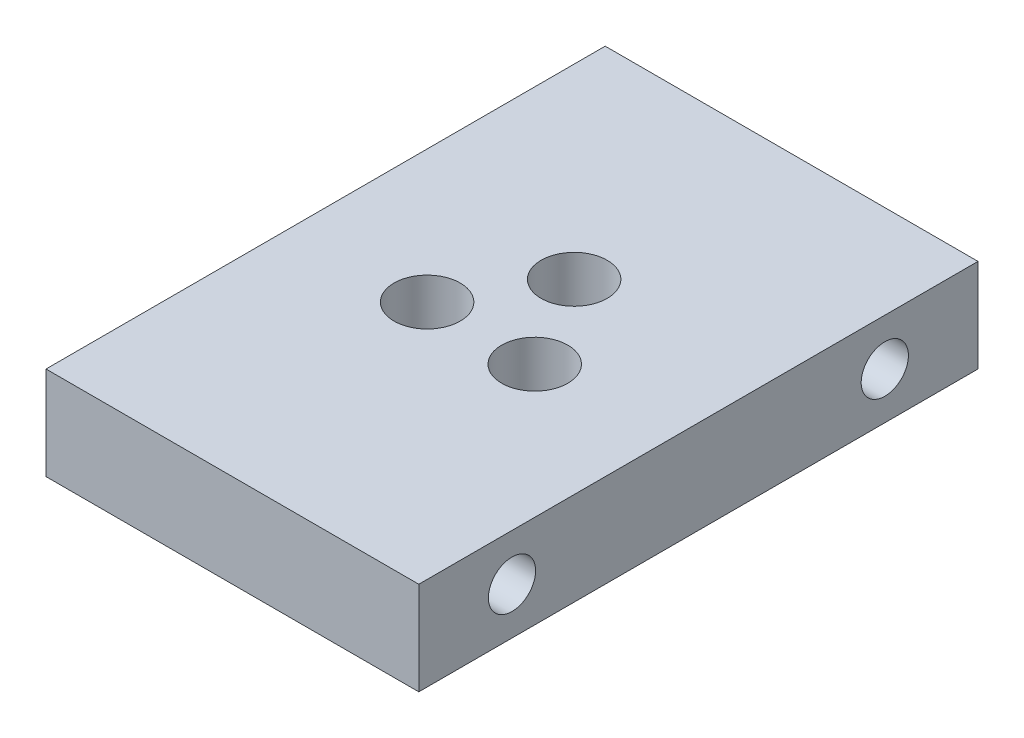
ISO-10303-21;
HEADER;
FILE_DESCRIPTION(('STEP AP214'),'2;1');
FILE_NAME('part.step','',(''),(''),'','','');
FILE_SCHEMA(('AUTOMOTIVE_DESIGN { 1 0 10303 214 1 1 1 1 }'));
ENDSEC;
DATA;
#1=APPLICATION_CONTEXT('core data for automotive mechanical design processes');
#2=APPLICATION_PROTOCOL_DEFINITION('international standard','automotive_design',2000,#1);
#3=PRODUCT_CONTEXT('',#1,'mechanical');
#4=PRODUCT('Part','Part','',(#3));
#5=PRODUCT_RELATED_PRODUCT_CATEGORY('part','',(#4));
#6=PRODUCT_DEFINITION_FORMATION('','',#4);
#7=PRODUCT_DEFINITION_CONTEXT('part definition',#1,'design');
#8=PRODUCT_DEFINITION('design','',#6,#7);
#9=PRODUCT_DEFINITION_SHAPE('','',#8);
#10=(LENGTH_UNIT() NAMED_UNIT(*) SI_UNIT(.MILLI.,.METRE.));
#11=(NAMED_UNIT(*) PLANE_ANGLE_UNIT() SI_UNIT($,.RADIAN.));
#12=(NAMED_UNIT(*) SI_UNIT($,.STERADIAN.) SOLID_ANGLE_UNIT());
#13=UNCERTAINTY_MEASURE_WITH_UNIT(LENGTH_MEASURE(1.E-05),#10,'distance_accuracy_value','');
#14=(GEOMETRIC_REPRESENTATION_CONTEXT(3) GLOBAL_UNCERTAINTY_ASSIGNED_CONTEXT((#13)) GLOBAL_UNIT_ASSIGNED_CONTEXT((#10,
#11,#12)) REPRESENTATION_CONTEXT('',''));
#15=CARTESIAN_POINT('',(0.,0.,0.));
#16=DIRECTION('',(0.,0.,1.));
#17=DIRECTION('',(1.,0.,0.));
#18=AXIS2_PLACEMENT_3D('',#15,#16,#17);
#19=CARTESIAN_POINT('',(19.05,9.525,-28.575));
#20=DIRECTION('',(-1.,0.,0.));
#21=DIRECTION('',(0.,0.,1.));
#22=AXIS2_PLACEMENT_3D('',#19,#20,#21);
#23=PLANE('',#22);
#24=CARTESIAN_POINT('',(19.05,4.7625,19.05));
#25=DIRECTION('',(1.,0.,0.));
#26=DIRECTION('',(0.,0.,-1.));
#27=AXIS2_PLACEMENT_3D('',#24,#25,#26);
#28=CIRCLE('',#27,2.413);
#29=CARTESIAN_POINT('',(19.05,4.7625,16.637));
#30=VERTEX_POINT('',#29);
#31=EDGE_CURVE('E140',#30,#30,#28,.T.);
#32=ORIENTED_EDGE('',*,*,#31,.F.);
#33=EDGE_LOOP('',(#32));
#34=FACE_BOUND('',#33,.T.);
#35=CARTESIAN_POINT('',(19.05,4.7625,-19.05));
#36=DIRECTION('',(1.,0.,0.));
#37=DIRECTION('',(0.,0.,-1.));
#38=AXIS2_PLACEMENT_3D('',#35,#36,#37);
#39=CIRCLE('',#38,2.413);
#40=CARTESIAN_POINT('',(19.05,4.7625,-21.463));
#41=VERTEX_POINT('',#40);
#42=EDGE_CURVE('E152',#41,#41,#39,.T.);
#43=ORIENTED_EDGE('',*,*,#42,.F.);
#44=EDGE_LOOP('',(#43));
#45=FACE_BOUND('',#44,.T.);
#46=DIRECTION('',(0.,0.,-1.));
#47=VECTOR('',#46,1.);
#48=CARTESIAN_POINT('',(19.05,0.,-28.575));
#49=LINE('',#48,#47);
#50=CARTESIAN_POINT('',(19.05,0.,28.575));
#51=VERTEX_POINT('',#50);
#52=CARTESIAN_POINT('',(19.05,0.,-28.575));
#53=VERTEX_POINT('',#52);
#54=EDGE_CURVE('E206',#51,#53,#49,.T.);
#55=ORIENTED_EDGE('',*,*,#54,.T.);
#56=DIRECTION('',(0.,-1.,0.));
#57=VECTOR('',#56,1.);
#58=CARTESIAN_POINT('',(19.05,9.525,-28.575));
#59=LINE('',#58,#57);
#60=CARTESIAN_POINT('',(19.05,9.525,-28.575));
#61=VERTEX_POINT('',#60);
#62=EDGE_CURVE('E11',#61,#53,#59,.T.);
#63=ORIENTED_EDGE('',*,*,#62,.F.);
#64=DIRECTION('',(0.,0.,-1.));
#65=VECTOR('',#64,1.);
#66=CARTESIAN_POINT('',(19.05,9.525,-28.575));
#67=LINE('',#66,#65);
#68=CARTESIAN_POINT('',(19.05,9.525,28.575));
#69=VERTEX_POINT('',#68);
#70=EDGE_CURVE('E207',#69,#61,#67,.T.);
#71=ORIENTED_EDGE('',*,*,#70,.F.);
#72=DIRECTION('',(0.,-1.,0.));
#73=VECTOR('',#72,1.);
#74=CARTESIAN_POINT('',(19.05,9.525,28.575));
#75=LINE('',#74,#73);
#76=EDGE_CURVE('E213',#69,#51,#75,.T.);
#77=ORIENTED_EDGE('',*,*,#76,.T.);
#78=EDGE_LOOP('',(#55,#63,#71,#77));
#79=FACE_BOUND('',#78,.T.);
#80=ADVANCED_FACE('F33',(#34,#45,#79),#23,.F.);
#81=CARTESIAN_POINT('',(-19.05,9.525,-28.575));
#82=DIRECTION('',(0.,0.,1.));
#83=DIRECTION('',(1.,0.,0.));
#84=AXIS2_PLACEMENT_3D('',#81,#82,#83);
#85=PLANE('',#84);
#86=DIRECTION('',(-1.,0.,0.));
#87=VECTOR('',#86,1.);
#88=CARTESIAN_POINT('',(-19.05,0.,-28.575));
#89=LINE('',#88,#87);
#90=CARTESIAN_POINT('',(-19.05,0.,-28.575));
#91=VERTEX_POINT('',#90);
#92=EDGE_CURVE('E216',#53,#91,#89,.T.);
#93=ORIENTED_EDGE('',*,*,#92,.T.);
#94=DIRECTION('',(0.,-1.,0.));
#95=VECTOR('',#94,1.);
#96=CARTESIAN_POINT('',(-19.05,9.525,-28.575));
#97=LINE('',#96,#95);
#98=CARTESIAN_POINT('',(-19.05,9.525,-28.575));
#99=VERTEX_POINT('',#98);
#100=EDGE_CURVE('E41',#99,#91,#97,.T.);
#101=ORIENTED_EDGE('',*,*,#100,.F.);
#102=DIRECTION('',(-1.,0.,0.));
#103=VECTOR('',#102,1.);
#104=CARTESIAN_POINT('',(-19.05,9.525,-28.575));
#105=LINE('',#104,#103);
#106=EDGE_CURVE('E80',#61,#99,#105,.T.);
#107=ORIENTED_EDGE('',*,*,#106,.F.);
#108=ORIENTED_EDGE('',*,*,#62,.T.);
#109=EDGE_LOOP('',(#93,#101,#107,#108));
#110=FACE_BOUND('',#109,.T.);
#111=ADVANCED_FACE('F240',(#110),#85,.F.);
#112=CARTESIAN_POINT('',(-19.05,9.525,-28.575));
#113=DIRECTION('',(1.,0.,0.));
#114=DIRECTION('',(0.,0.,-1.));
#115=AXIS2_PLACEMENT_3D('',#112,#113,#114);
#116=PLANE('',#115);
#117=CARTESIAN_POINT('',(-19.05,4.7625,-19.05));
#118=DIRECTION('',(-1.,0.,0.));
#119=DIRECTION('',(0.,0.,1.));
#120=AXIS2_PLACEMENT_3D('',#117,#118,#119);
#121=CIRCLE('',#120,2.413);
#122=CARTESIAN_POINT('',(-19.05,4.7625,-16.637));
#123=VERTEX_POINT('',#122);
#124=EDGE_CURVE('E488',#123,#123,#121,.T.);
#125=ORIENTED_EDGE('',*,*,#124,.F.);
#126=EDGE_LOOP('',(#125));
#127=FACE_BOUND('',#126,.T.);
#128=CARTESIAN_POINT('',(-19.05,4.7625,19.05));
#129=DIRECTION('',(-1.,0.,0.));
#130=DIRECTION('',(0.,0.,1.));
#131=AXIS2_PLACEMENT_3D('',#128,#129,#130);
#132=CIRCLE('',#131,2.413);
#133=CARTESIAN_POINT('',(-19.05,4.7625,21.463));
#134=VERTEX_POINT('',#133);
#135=EDGE_CURVE('E121',#134,#134,#132,.T.);
#136=ORIENTED_EDGE('',*,*,#135,.F.);
#137=EDGE_LOOP('',(#136));
#138=FACE_BOUND('',#137,.T.);
#139=DIRECTION('',(0.,0.,1.));
#140=VECTOR('',#139,1.);
#141=CARTESIAN_POINT('',(-19.05,0.,-28.575));
#142=LINE('',#141,#140);
#143=CARTESIAN_POINT('',(-19.05,0.,28.575));
#144=VERTEX_POINT('',#143);
#145=EDGE_CURVE('E67',#91,#144,#142,.T.);
#146=ORIENTED_EDGE('',*,*,#145,.T.);
#147=DIRECTION('',(0.,-1.,0.));
#148=VECTOR('',#147,1.);
#149=CARTESIAN_POINT('',(-19.05,9.525,28.575));
#150=LINE('',#149,#148);
#151=CARTESIAN_POINT('',(-19.05,9.525,28.575));
#152=VERTEX_POINT('',#151);
#153=EDGE_CURVE('E221',#152,#144,#150,.T.);
#154=ORIENTED_EDGE('',*,*,#153,.F.);
#155=DIRECTION('',(0.,0.,1.));
#156=VECTOR('',#155,1.);
#157=CARTESIAN_POINT('',(-19.05,9.525,-28.575));
#158=LINE('',#157,#156);
#159=EDGE_CURVE('E210',#99,#152,#158,.T.);
#160=ORIENTED_EDGE('',*,*,#159,.F.);
#161=ORIENTED_EDGE('',*,*,#100,.T.);
#162=EDGE_LOOP('',(#146,#154,#160,#161));
#163=FACE_BOUND('',#162,.T.);
#164=ADVANCED_FACE('F223',(#127,#138,#163),#116,.F.);
#165=CARTESIAN_POINT('',(-19.05,9.525,28.575));
#166=DIRECTION('',(0.,0.,-1.));
#167=DIRECTION('',(-1.,0.,0.));
#168=AXIS2_PLACEMENT_3D('',#165,#166,#167);
#169=PLANE('',#168);
#170=DIRECTION('',(1.,0.,0.));
#171=VECTOR('',#170,1.);
#172=CARTESIAN_POINT('',(-19.05,0.,28.575));
#173=LINE('',#172,#171);
#174=EDGE_CURVE('E73',#144,#51,#173,.T.);
#175=ORIENTED_EDGE('',*,*,#174,.T.);
#176=ORIENTED_EDGE('',*,*,#76,.F.);
#177=DIRECTION('',(1.,0.,0.));
#178=VECTOR('',#177,1.);
#179=CARTESIAN_POINT('',(-19.05,9.525,28.575));
#180=LINE('',#179,#178);
#181=EDGE_CURVE('E49',#152,#69,#180,.T.);
#182=ORIENTED_EDGE('',*,*,#181,.F.);
#183=ORIENTED_EDGE('',*,*,#153,.T.);
#184=EDGE_LOOP('',(#175,#176,#182,#183));
#185=FACE_BOUND('',#184,.T.);
#186=ADVANCED_FACE('F230',(#185),#169,.F.);
#187=CARTESIAN_POINT('',(0.,9.525,0.));
#188=DIRECTION('',(0.,1.,0.));
#189=DIRECTION('',(0.,0.,1.));
#190=AXIS2_PLACEMENT_3D('',#187,#188,#189);
#191=PLANE('',#190);
#192=CARTESIAN_POINT('',(0.,9.525,-6.35));
#193=DIRECTION('',(0.,-1.,0.));
#194=DIRECTION('',(0.,0.,-1.));
#195=AXIS2_PLACEMENT_3D('',#192,#193,#194);
#196=CIRCLE('',#195,3.3782);
#197=CARTESIAN_POINT('',(0.,9.525,-9.7282));
#198=VERTEX_POINT('',#197);
#199=EDGE_CURVE('E172',#198,#198,#196,.T.);
#200=ORIENTED_EDGE('',*,*,#199,.T.);
#201=EDGE_LOOP('',(#200));
#202=FACE_BOUND('',#201,.T.);
#203=CARTESIAN_POINT('',(-5.49926131403199,9.525,3.17499999999953));
#204=DIRECTION('',(0.,-1.,0.));
#205=DIRECTION('',(0.,0.,-1.));
#206=AXIS2_PLACEMENT_3D('',#203,#204,#205);
#207=CIRCLE('',#206,3.3782);
#208=CARTESIAN_POINT('',(-5.49926131403199,9.525,-0.203200000000466));
#209=VERTEX_POINT('',#208);
#210=EDGE_CURVE('E190',#209,#209,#207,.T.);
#211=ORIENTED_EDGE('',*,*,#210,.T.);
#212=EDGE_LOOP('',(#211));
#213=FACE_BOUND('',#212,.T.);
#214=CARTESIAN_POINT('',(5.49926131403038,9.525,3.17500000000047));
#215=DIRECTION('',(0.,-1.,0.));
#216=DIRECTION('',(0.,0.,-1.));
#217=AXIS2_PLACEMENT_3D('',#214,#215,#216);
#218=CIRCLE('',#217,3.3782);
#219=CARTESIAN_POINT('',(5.49926131403038,9.525,-0.203199999999531));
#220=VERTEX_POINT('',#219);
#221=EDGE_CURVE('E203',#220,#220,#218,.T.);
#222=ORIENTED_EDGE('',*,*,#221,.T.);
#223=EDGE_LOOP('',(#222));
#224=FACE_BOUND('',#223,.T.);
#225=ORIENTED_EDGE('',*,*,#70,.T.);
#226=ORIENTED_EDGE('',*,*,#106,.T.);
#227=ORIENTED_EDGE('',*,*,#159,.T.);
#228=ORIENTED_EDGE('',*,*,#181,.T.);
#229=EDGE_LOOP('',(#225,#226,#227,#228));
#230=FACE_BOUND('',#229,.T.);
#231=ADVANCED_FACE('F232',(#202,#213,#224,#230),#191,.T.);
#232=CARTESIAN_POINT('',(0.,0.,0.));
#233=DIRECTION('',(0.,1.,0.));
#234=DIRECTION('',(0.,0.,1.));
#235=AXIS2_PLACEMENT_3D('',#232,#233,#234);
#236=PLANE('',#235);
#237=CARTESIAN_POINT('',(5.49926131403038,0.,3.17500000000047));
#238=DIRECTION('',(0.,-1.,0.));
#239=DIRECTION('',(0.,0.,-1.));
#240=AXIS2_PLACEMENT_3D('',#237,#238,#239);
#241=CIRCLE('',#240,7.14374999999999);
#242=CARTESIAN_POINT('',(6.69848704803227,0.,-3.86737330034421));
#243=VERTEX_POINT('',#242);
#244=CARTESIAN_POINT('',(-1.19609183668601E-12,0.,7.73474660068955));
#245=VERTEX_POINT('',#244);
#246=EDGE_CURVE('E196',#243,#245,#241,.T.);
#247=ORIENTED_EDGE('',*,*,#246,.F.);
#248=CARTESIAN_POINT('',(0.,0.,-6.35));
#249=DIRECTION('',(0.,-1.,0.));
#250=DIRECTION('',(0.,0.,-1.));
#251=AXIS2_PLACEMENT_3D('',#248,#249,#250);
#252=CIRCLE('',#251,7.14374999999999);
#253=CARTESIAN_POINT('',(-6.69848704803269,0.,-3.86737330034535));
#254=VERTEX_POINT('',#253);
#255=EDGE_CURVE('E164',#254,#243,#252,.T.);
#256=ORIENTED_EDGE('',*,*,#255,.F.);
#257=CARTESIAN_POINT('',(-5.49926131403199,0.,3.17499999999953));
#258=DIRECTION('',(0.,-1.,0.));
#259=DIRECTION('',(0.,0.,-1.));
#260=AXIS2_PLACEMENT_3D('',#257,#258,#259);
#261=CIRCLE('',#260,7.14374999999999);
#262=EDGE_CURVE('E181',#245,#254,#261,.T.);
#263=ORIENTED_EDGE('',*,*,#262,.F.);
#264=EDGE_LOOP('',(#247,#256,#263));
#265=FACE_BOUND('',#264,.T.);
#266=ORIENTED_EDGE('',*,*,#54,.F.);
#267=ORIENTED_EDGE('',*,*,#174,.F.);
#268=ORIENTED_EDGE('',*,*,#145,.F.);
#269=ORIENTED_EDGE('',*,*,#92,.F.);
#270=EDGE_LOOP('',(#266,#267,#268,#269));
#271=FACE_BOUND('',#270,.T.);
#272=ADVANCED_FACE('F226',(#265,#271),#236,.F.);
#273=CARTESIAN_POINT('',(5.49926131403038,0.,3.17500000000047));
#274=DIRECTION('',(0.,-1.,0.));
#275=DIRECTION('',(0.,0.,-1.));
#276=AXIS2_PLACEMENT_3D('',#273,#274,#275);
#277=CYLINDRICAL_SURFACE('',#276,3.3782);
#278=ORIENTED_EDGE('',*,*,#221,.F.);
#279=EDGE_LOOP('',(#278));
#280=FACE_BOUND('',#279,.T.);
#281=CARTESIAN_POINT('',(5.49926131403038,4.191,3.17500000000047));
#282=DIRECTION('',(0.,-1.,0.));
#283=DIRECTION('',(0.,0.,-1.));
#284=AXIS2_PLACEMENT_3D('',#281,#282,#283);
#285=CIRCLE('',#284,3.3782);
#286=CARTESIAN_POINT('',(5.49926131403038,4.191,-0.203199999999533));
#287=VERTEX_POINT('',#286);
#288=EDGE_CURVE('E200',#287,#287,#285,.T.);
#289=ORIENTED_EDGE('',*,*,#288,.T.);
#290=EDGE_LOOP('',(#289));
#291=FACE_BOUND('',#290,.T.);
#292=ADVANCED_FACE('F302',(#280,#291),#277,.F.);
#293=CARTESIAN_POINT('',(8.87746131403038,4.191,3.17500000000047));
#294=DIRECTION('',(0.,1.,0.));
#295=DIRECTION('',(0.,0.,1.));
#296=AXIS2_PLACEMENT_3D('',#293,#294,#295);
#297=PLANE('',#296);
#298=CARTESIAN_POINT('',(0.,4.191,-6.35));
#299=DIRECTION('',(0.,-1.,0.));
#300=DIRECTION('',(0.,0.,-1.));
#301=AXIS2_PLACEMENT_3D('',#298,#299,#300);
#302=CIRCLE('',#301,7.14375);
#303=CARTESIAN_POINT('',(-6.6984870480327,4.191,-3.86737330034535));
#304=VERTEX_POINT('',#303);
#305=CARTESIAN_POINT('',(6.69848704803228,4.191,-3.86737330034421));
#306=VERTEX_POINT('',#305);
#307=EDGE_CURVE('E166',#304,#306,#302,.T.);
#308=ORIENTED_EDGE('',*,*,#307,.T.);
#309=CARTESIAN_POINT('',(5.49926131403038,4.191,3.17500000000047));
#310=DIRECTION('',(0.,-1.,0.));
#311=DIRECTION('',(0.,0.,-1.));
#312=AXIS2_PLACEMENT_3D('',#309,#310,#311);
#313=CIRCLE('',#312,7.14375);
#314=CARTESIAN_POINT('',(-1.19522447494802E-12,4.191,7.73474660068955));
#315=VERTEX_POINT('',#314);
#316=EDGE_CURVE('E198',#306,#315,#313,.T.);
#317=ORIENTED_EDGE('',*,*,#316,.T.);
#318=CARTESIAN_POINT('',(-5.49926131403199,4.191,3.17499999999953));
#319=DIRECTION('',(0.,-1.,0.));
#320=DIRECTION('',(0.,0.,-1.));
#321=AXIS2_PLACEMENT_3D('',#318,#319,#320);
#322=CIRCLE('',#321,7.14375);
#323=EDGE_CURVE('E184',#315,#304,#322,.T.);
#324=ORIENTED_EDGE('',*,*,#323,.T.);
#325=EDGE_LOOP('',(#308,#317,#324));
#326=FACE_BOUND('',#325,.T.);
#327=CARTESIAN_POINT('',(-5.49926131403199,4.191,3.17499999999953));
#328=DIRECTION('',(0.,-1.,0.));
#329=DIRECTION('',(0.,0.,-1.));
#330=AXIS2_PLACEMENT_3D('',#327,#328,#329);
#331=CIRCLE('',#330,3.3782);
#332=CARTESIAN_POINT('',(-5.49926131403199,4.191,-0.203200000000467));
#333=VERTEX_POINT('',#332);
#334=EDGE_CURVE('E187',#333,#333,#331,.T.);
#335=ORIENTED_EDGE('',*,*,#334,.F.);
#336=EDGE_LOOP('',(#335));
#337=FACE_BOUND('',#336,.T.);
#338=ORIENTED_EDGE('',*,*,#288,.F.);
#339=EDGE_LOOP('',(#338));
#340=FACE_BOUND('',#339,.T.);
#341=CARTESIAN_POINT('',(0.,4.191,-6.35));
#342=DIRECTION('',(0.,-1.,0.));
#343=DIRECTION('',(0.,0.,-1.));
#344=AXIS2_PLACEMENT_3D('',#341,#342,#343);
#345=CIRCLE('',#344,3.3782);
#346=CARTESIAN_POINT('',(0.,4.191,-9.7282));
#347=VERTEX_POINT('',#346);
#348=EDGE_CURVE('E169',#347,#347,#345,.T.);
#349=ORIENTED_EDGE('',*,*,#348,.F.);
#350=EDGE_LOOP('',(#349));
#351=FACE_BOUND('',#350,.T.);
#352=ADVANCED_FACE('F298',(#326,#337,#340,#351),#297,.F.);
#353=CARTESIAN_POINT('',(5.49926131403038,0.,3.17500000000047));
#354=DIRECTION('',(0.,-1.,0.));
#355=DIRECTION('',(0.,0.,-1.));
#356=AXIS2_PLACEMENT_3D('',#353,#354,#355);
#357=CYLINDRICAL_SURFACE('',#356,7.14374999999999);
#358=ORIENTED_EDGE('',*,*,#316,.F.);
#359=DIRECTION('',(0.,-1.,0.));
#360=VECTOR('',#359,1.);
#361=CARTESIAN_POINT('',(6.69848704803227,2.0955,-3.86737330034421));
#362=LINE('',#361,#360);
#363=EDGE_CURVE('E178',#306,#243,#362,.T.);
#364=ORIENTED_EDGE('',*,*,#363,.T.);
#365=ORIENTED_EDGE('',*,*,#246,.T.);
#366=DIRECTION('',(0.,-1.,0.));
#367=VECTOR('',#366,1.);
#368=CARTESIAN_POINT('',(-1.19522447494802E-12,2.0955,7.73474660068955));
#369=LINE('',#368,#367);
#370=EDGE_CURVE('E193',#245,#315,#369,.F.);
#371=ORIENTED_EDGE('',*,*,#370,.T.);
#372=EDGE_LOOP('',(#358,#364,#365,#371));
#373=FACE_BOUND('',#372,.T.);
#374=ADVANCED_FACE('F291',(#373),#357,.F.);
#375=CARTESIAN_POINT('',(-5.49926131403199,0.,3.17499999999953));
#376=DIRECTION('',(0.,-1.,0.));
#377=DIRECTION('',(0.,0.,-1.));
#378=AXIS2_PLACEMENT_3D('',#375,#376,#377);
#379=CYLINDRICAL_SURFACE('',#378,7.14375);
#380=ORIENTED_EDGE('',*,*,#262,.T.);
#381=DIRECTION('',(0.,-1.,0.));
#382=VECTOR('',#381,1.);
#383=CARTESIAN_POINT('',(-6.6984870480327,2.0955,-3.86737330034535));
#384=LINE('',#383,#382);
#385=EDGE_CURVE('E175',#254,#304,#384,.F.);
#386=ORIENTED_EDGE('',*,*,#385,.T.);
#387=ORIENTED_EDGE('',*,*,#323,.F.);
#388=ORIENTED_EDGE('',*,*,#370,.F.);
#389=EDGE_LOOP('',(#380,#386,#387,#388));
#390=FACE_BOUND('',#389,.T.);
#391=ADVANCED_FACE('F288',(#390),#379,.F.);
#392=CARTESIAN_POINT('',(-5.49926131403199,0.,3.17499999999953));
#393=DIRECTION('',(0.,-1.,0.));
#394=DIRECTION('',(0.,0.,-1.));
#395=AXIS2_PLACEMENT_3D('',#392,#393,#394);
#396=CYLINDRICAL_SURFACE('',#395,3.3782);
#397=ORIENTED_EDGE('',*,*,#210,.F.);
#398=EDGE_LOOP('',(#397));
#399=FACE_BOUND('',#398,.T.);
#400=ORIENTED_EDGE('',*,*,#334,.T.);
#401=EDGE_LOOP('',(#400));
#402=FACE_BOUND('',#401,.T.);
#403=ADVANCED_FACE('F283',(#399,#402),#396,.F.);
#404=CARTESIAN_POINT('',(0.,0.,-6.35));
#405=DIRECTION('',(0.,-1.,0.));
#406=DIRECTION('',(0.,0.,-1.));
#407=AXIS2_PLACEMENT_3D('',#404,#405,#406);
#408=CYLINDRICAL_SURFACE('',#407,7.14375);
#409=ORIENTED_EDGE('',*,*,#307,.F.);
#410=ORIENTED_EDGE('',*,*,#385,.F.);
#411=ORIENTED_EDGE('',*,*,#255,.T.);
#412=ORIENTED_EDGE('',*,*,#363,.F.);
#413=EDGE_LOOP('',(#409,#410,#411,#412));
#414=FACE_BOUND('',#413,.T.);
#415=ADVANCED_FACE('F280',(#414),#408,.F.);
#416=CARTESIAN_POINT('',(0.,0.,-6.35));
#417=DIRECTION('',(0.,-1.,0.));
#418=DIRECTION('',(0.,0.,-1.));
#419=AXIS2_PLACEMENT_3D('',#416,#417,#418);
#420=CYLINDRICAL_SURFACE('',#419,3.3782);
#421=ORIENTED_EDGE('',*,*,#199,.F.);
#422=EDGE_LOOP('',(#421));
#423=FACE_BOUND('',#422,.T.);
#424=ORIENTED_EDGE('',*,*,#348,.T.);
#425=EDGE_LOOP('',(#424));
#426=FACE_BOUND('',#425,.T.);
#427=ADVANCED_FACE('F278',(#423,#426),#420,.F.);
#428=CARTESIAN_POINT('',(6.35,4.7625,-19.05));
#429=DIRECTION('',(1.,0.,0.));
#430=DIRECTION('',(0.,0.,-1.));
#431=AXIS2_PLACEMENT_3D('',#428,#429,#430);
#432=CONICAL_SURFACE('',#431,2.0193,1.02974425867665);
#433=CARTESIAN_POINT('',(5.13668215199764,4.7625,-19.05));
#434=VERTEX_POINT('',#433);
#435=VERTEX_LOOP('',#434);
#436=FACE_BOUND('',#435,.T.);
#437=CARTESIAN_POINT('',(6.35,4.7625,-19.05));
#438=DIRECTION('',(1.,0.,0.));
#439=DIRECTION('',(0.,0.,-1.));
#440=AXIS2_PLACEMENT_3D('',#437,#438,#439);
#441=CIRCLE('',#440,2.0193);
#442=CARTESIAN_POINT('',(6.35,4.7625,-21.0693));
#443=VERTEX_POINT('',#442);
#444=EDGE_CURVE('E161',#443,#443,#441,.T.);
#445=ORIENTED_EDGE('',*,*,#444,.T.);
#446=EDGE_LOOP('',(#445));
#447=FACE_BOUND('',#446,.T.);
#448=ADVANCED_FACE('F274',(#436,#447),#432,.F.);
#449=CARTESIAN_POINT('',(19.05,4.7625,-19.05));
#450=DIRECTION('',(1.,0.,0.));
#451=DIRECTION('',(0.,0.,-1.));
#452=AXIS2_PLACEMENT_3D('',#449,#450,#451);
#453=CYLINDRICAL_SURFACE('',#452,2.0193);
#454=ORIENTED_EDGE('',*,*,#444,.F.);
#455=EDGE_LOOP('',(#454));
#456=FACE_BOUND('',#455,.T.);
#457=CARTESIAN_POINT('',(9.39799999999999,4.7625,-19.05));
#458=DIRECTION('',(1.,0.,0.));
#459=DIRECTION('',(0.,0.,-1.));
#460=AXIS2_PLACEMENT_3D('',#457,#458,#459);
#461=CIRCLE('',#460,2.0193);
#462=CARTESIAN_POINT('',(9.39799999999999,4.7625,-21.0693));
#463=VERTEX_POINT('',#462);
#464=EDGE_CURVE('E158',#463,#463,#461,.T.);
#465=ORIENTED_EDGE('',*,*,#464,.T.);
#466=EDGE_LOOP('',(#465));
#467=FACE_BOUND('',#466,.T.);
#468=ADVANCED_FACE('F266',(#456,#467),#453,.F.);
#469=CARTESIAN_POINT('',(9.39799999999999,6.7818,-19.05));
#470=DIRECTION('',(-1.,0.,0.));
#471=DIRECTION('',(0.,0.,1.));
#472=AXIS2_PLACEMENT_3D('',#469,#470,#471);
#473=PLANE('',#472);
#474=ORIENTED_EDGE('',*,*,#464,.F.);
#475=EDGE_LOOP('',(#474));
#476=FACE_BOUND('',#475,.T.);
#477=CARTESIAN_POINT('',(9.39799999999999,4.7625,-19.05));
#478=DIRECTION('',(1.,0.,0.));
#479=DIRECTION('',(0.,0.,-1.));
#480=AXIS2_PLACEMENT_3D('',#477,#478,#479);
#481=CIRCLE('',#480,2.413);
#482=CARTESIAN_POINT('',(9.39799999999999,4.7625,-21.463));
#483=VERTEX_POINT('',#482);
#484=EDGE_CURVE('E155',#483,#483,#481,.T.);
#485=ORIENTED_EDGE('',*,*,#484,.T.);
#486=EDGE_LOOP('',(#485));
#487=FACE_BOUND('',#486,.T.);
#488=ADVANCED_FACE('F256',(#476,#487),#473,.F.);
#489=CARTESIAN_POINT('',(19.05,4.7625,-19.05));
#490=DIRECTION('',(1.,0.,0.));
#491=DIRECTION('',(0.,0.,-1.));
#492=AXIS2_PLACEMENT_3D('',#489,#490,#491);
#493=CYLINDRICAL_SURFACE('',#492,2.413);
#494=ORIENTED_EDGE('',*,*,#484,.F.);
#495=EDGE_LOOP('',(#494));
#496=FACE_BOUND('',#495,.T.);
#497=ORIENTED_EDGE('',*,*,#42,.T.);
#498=EDGE_LOOP('',(#497));
#499=FACE_BOUND('',#498,.T.);
#500=ADVANCED_FACE('F253',(#496,#499),#493,.F.);
#501=CARTESIAN_POINT('',(6.35000000000001,4.7625,19.05));
#502=DIRECTION('',(1.,0.,0.));
#503=DIRECTION('',(0.,0.,-1.));
#504=AXIS2_PLACEMENT_3D('',#501,#502,#503);
#505=CONICAL_SURFACE('',#504,2.0193,1.02974425867665);
#506=CARTESIAN_POINT('',(5.13668215199765,4.7625,19.05));
#507=VERTEX_POINT('',#506);
#508=VERTEX_LOOP('',#507);
#509=FACE_BOUND('',#508,.T.);
#510=CARTESIAN_POINT('',(6.35000000000001,4.7625,19.05));
#511=DIRECTION('',(1.,0.,0.));
#512=DIRECTION('',(0.,0.,-1.));
#513=AXIS2_PLACEMENT_3D('',#510,#511,#512);
#514=CIRCLE('',#513,2.0193);
#515=CARTESIAN_POINT('',(6.35000000000001,4.7625,17.0307));
#516=VERTEX_POINT('',#515);
#517=EDGE_CURVE('E149',#516,#516,#514,.T.);
#518=ORIENTED_EDGE('',*,*,#517,.T.);
#519=EDGE_LOOP('',(#518));
#520=FACE_BOUND('',#519,.T.);
#521=ADVANCED_FACE('F255',(#509,#520),#505,.F.);
#522=CARTESIAN_POINT('',(19.05,4.7625,19.05));
#523=DIRECTION('',(1.,0.,0.));
#524=DIRECTION('',(0.,0.,-1.));
#525=AXIS2_PLACEMENT_3D('',#522,#523,#524);
#526=CYLINDRICAL_SURFACE('',#525,2.0193);
#527=ORIENTED_EDGE('',*,*,#517,.F.);
#528=EDGE_LOOP('',(#527));
#529=FACE_BOUND('',#528,.T.);
#530=CARTESIAN_POINT('',(9.398,4.7625,19.05));
#531=DIRECTION('',(1.,0.,0.));
#532=DIRECTION('',(0.,0.,-1.));
#533=AXIS2_PLACEMENT_3D('',#530,#531,#532);
#534=CIRCLE('',#533,2.0193);
#535=CARTESIAN_POINT('',(9.398,4.7625,17.0307));
#536=VERTEX_POINT('',#535);
#537=EDGE_CURVE('E146',#536,#536,#534,.T.);
#538=ORIENTED_EDGE('',*,*,#537,.T.);
#539=EDGE_LOOP('',(#538));
#540=FACE_BOUND('',#539,.T.);
#541=ADVANCED_FACE('F263',(#529,#540),#526,.F.);
#542=CARTESIAN_POINT('',(9.398,6.7818,19.05));
#543=DIRECTION('',(-1.,0.,0.));
#544=DIRECTION('',(0.,0.,1.));
#545=AXIS2_PLACEMENT_3D('',#542,#543,#544);
#546=PLANE('',#545);
#547=ORIENTED_EDGE('',*,*,#537,.F.);
#548=EDGE_LOOP('',(#547));
#549=FACE_BOUND('',#548,.T.);
#550=CARTESIAN_POINT('',(9.398,4.7625,19.05));
#551=DIRECTION('',(1.,0.,0.));
#552=DIRECTION('',(0.,0.,-1.));
#553=AXIS2_PLACEMENT_3D('',#550,#551,#552);
#554=CIRCLE('',#553,2.413);
#555=CARTESIAN_POINT('',(9.398,4.7625,16.637));
#556=VERTEX_POINT('',#555);
#557=EDGE_CURVE('E143',#556,#556,#554,.T.);
#558=ORIENTED_EDGE('',*,*,#557,.T.);
#559=EDGE_LOOP('',(#558));
#560=FACE_BOUND('',#559,.T.);
#561=ADVANCED_FACE('F387',(#549,#560),#546,.F.);
#562=CARTESIAN_POINT('',(19.05,4.7625,19.05));
#563=DIRECTION('',(1.,0.,0.));
#564=DIRECTION('',(0.,0.,-1.));
#565=AXIS2_PLACEMENT_3D('',#562,#563,#564);
#566=CYLINDRICAL_SURFACE('',#565,2.413);
#567=ORIENTED_EDGE('',*,*,#557,.F.);
#568=EDGE_LOOP('',(#567));
#569=FACE_BOUND('',#568,.T.);
#570=ORIENTED_EDGE('',*,*,#31,.T.);
#571=EDGE_LOOP('',(#570));
#572=FACE_BOUND('',#571,.T.);
#573=ADVANCED_FACE('F396',(#569,#572),#566,.F.);
#574=CARTESIAN_POINT('',(-6.35000000000001,4.7625,19.05));
#575=DIRECTION('',(-1.,0.,0.));
#576=DIRECTION('',(0.,0.,1.));
#577=AXIS2_PLACEMENT_3D('',#574,#575,#576);
#578=CONICAL_SURFACE('',#577,2.0193,1.02974425867665);
#579=CARTESIAN_POINT('',(-5.13668215199765,4.7625,19.05));
#580=VERTEX_POINT('',#579);
#581=VERTEX_LOOP('',#580);
#582=FACE_BOUND('',#581,.T.);
#583=CARTESIAN_POINT('',(-6.35000000000001,4.7625,19.05));
#584=DIRECTION('',(-1.,0.,0.));
#585=DIRECTION('',(0.,0.,1.));
#586=AXIS2_PLACEMENT_3D('',#583,#584,#585);
#587=CIRCLE('',#586,2.0193);
#588=CARTESIAN_POINT('',(-6.35000000000001,4.7625,21.0693));
#589=VERTEX_POINT('',#588);
#590=EDGE_CURVE('E137',#589,#589,#587,.T.);
#591=ORIENTED_EDGE('',*,*,#590,.T.);
#592=EDGE_LOOP('',(#591));
#593=FACE_BOUND('',#592,.T.);
#594=ADVANCED_FACE('F406',(#582,#593),#578,.F.);
#595=CARTESIAN_POINT('',(-19.05,4.7625,19.05));
#596=DIRECTION('',(-1.,0.,0.));
#597=DIRECTION('',(0.,0.,1.));
#598=AXIS2_PLACEMENT_3D('',#595,#596,#597);
#599=CYLINDRICAL_SURFACE('',#598,2.0193);
#600=ORIENTED_EDGE('',*,*,#590,.F.);
#601=EDGE_LOOP('',(#600));
#602=FACE_BOUND('',#601,.T.);
#603=CARTESIAN_POINT('',(-9.398,4.7625,19.05));
#604=DIRECTION('',(-1.,0.,0.));
#605=DIRECTION('',(0.,0.,1.));
#606=AXIS2_PLACEMENT_3D('',#603,#604,#605);
#607=CIRCLE('',#606,2.0193);
#608=CARTESIAN_POINT('',(-9.398,4.7625,21.0693));
#609=VERTEX_POINT('',#608);
#610=EDGE_CURVE('E134',#609,#609,#607,.T.);
#611=ORIENTED_EDGE('',*,*,#610,.T.);
#612=EDGE_LOOP('',(#611));
#613=FACE_BOUND('',#612,.T.);
#614=ADVANCED_FACE('F416',(#602,#613),#599,.F.);
#615=CARTESIAN_POINT('',(-9.398,6.7818,19.05));
#616=DIRECTION('',(1.,0.,0.));
#617=DIRECTION('',(0.,0.,-1.));
#618=AXIS2_PLACEMENT_3D('',#615,#616,#617);
#619=PLANE('',#618);
#620=ORIENTED_EDGE('',*,*,#610,.F.);
#621=EDGE_LOOP('',(#620));
#622=FACE_BOUND('',#621,.T.);
#623=CARTESIAN_POINT('',(-9.398,4.7625,19.05));
#624=DIRECTION('',(-1.,0.,0.));
#625=DIRECTION('',(0.,0.,1.));
#626=AXIS2_PLACEMENT_3D('',#623,#624,#625);
#627=CIRCLE('',#626,2.413);
#628=CARTESIAN_POINT('',(-9.398,4.7625,21.463));
#629=VERTEX_POINT('',#628);
#630=EDGE_CURVE('E125',#629,#629,#627,.T.);
#631=ORIENTED_EDGE('',*,*,#630,.T.);
#632=EDGE_LOOP('',(#631));
#633=FACE_BOUND('',#632,.T.);
#634=ADVANCED_FACE('F426',(#622,#633),#619,.F.);
#635=CARTESIAN_POINT('',(-19.05,4.7625,19.05));
#636=DIRECTION('',(-1.,0.,0.));
#637=DIRECTION('',(0.,0.,1.));
#638=AXIS2_PLACEMENT_3D('',#635,#636,#637);
#639=CYLINDRICAL_SURFACE('',#638,2.413);
#640=ORIENTED_EDGE('',*,*,#630,.F.);
#641=EDGE_LOOP('',(#640));
#642=FACE_BOUND('',#641,.T.);
#643=ORIENTED_EDGE('',*,*,#135,.T.);
#644=EDGE_LOOP('',(#643));
#645=FACE_BOUND('',#644,.T.);
#646=ADVANCED_FACE('F115',(#642,#645),#639,.F.);
#647=CARTESIAN_POINT('',(-6.35000000000002,4.7625,-19.05));
#648=DIRECTION('',(-1.,0.,0.));
#649=DIRECTION('',(0.,0.,1.));
#650=AXIS2_PLACEMENT_3D('',#647,#648,#649);
#651=CONICAL_SURFACE('',#650,2.0193,1.02974425867665);
#652=CARTESIAN_POINT('',(-5.13668215199765,4.7625,-19.05));
#653=VERTEX_POINT('',#652);
#654=VERTEX_LOOP('',#653);
#655=FACE_BOUND('',#654,.T.);
#656=CARTESIAN_POINT('',(-6.35000000000002,4.7625,-19.05));
#657=DIRECTION('',(-1.,0.,0.));
#658=DIRECTION('',(0.,0.,1.));
#659=AXIS2_PLACEMENT_3D('',#656,#657,#658);
#660=CIRCLE('',#659,2.0193);
#661=CARTESIAN_POINT('',(-6.35000000000002,4.7625,-17.0307));
#662=VERTEX_POINT('',#661);
#663=EDGE_CURVE('E119',#662,#662,#660,.T.);
#664=ORIENTED_EDGE('',*,*,#663,.T.);
#665=EDGE_LOOP('',(#664));
#666=FACE_BOUND('',#665,.T.);
#667=ADVANCED_FACE('F111',(#655,#666),#651,.F.);
#668=CARTESIAN_POINT('',(-19.05,4.7625,-19.05));
#669=DIRECTION('',(-1.,0.,0.));
#670=DIRECTION('',(0.,0.,1.));
#671=AXIS2_PLACEMENT_3D('',#668,#669,#670);
#672=CYLINDRICAL_SURFACE('',#671,2.0193);
#673=ORIENTED_EDGE('',*,*,#663,.F.);
#674=EDGE_LOOP('',(#673));
#675=FACE_BOUND('',#674,.T.);
#676=CARTESIAN_POINT('',(-9.39800000000001,4.7625,-19.05));
#677=DIRECTION('',(-1.,0.,0.));
#678=DIRECTION('',(0.,0.,1.));
#679=AXIS2_PLACEMENT_3D('',#676,#677,#678);
#680=CIRCLE('',#679,2.0193);
#681=CARTESIAN_POINT('',(-9.39800000000001,4.7625,-17.0307));
#682=VERTEX_POINT('',#681);
#683=EDGE_CURVE('E122',#682,#682,#680,.T.);
#684=ORIENTED_EDGE('',*,*,#683,.T.);
#685=EDGE_LOOP('',(#684));
#686=FACE_BOUND('',#685,.T.);
#687=ADVANCED_FACE('F114',(#675,#686),#672,.F.);
#688=CARTESIAN_POINT('',(-9.398,6.7818,-19.05));
#689=DIRECTION('',(1.,0.,0.));
#690=DIRECTION('',(0.,0.,-1.));
#691=AXIS2_PLACEMENT_3D('',#688,#689,#690);
#692=PLANE('',#691);
#693=ORIENTED_EDGE('',*,*,#683,.F.);
#694=EDGE_LOOP('',(#693));
#695=FACE_BOUND('',#694,.T.);
#696=CARTESIAN_POINT('',(-9.398,4.7625,-19.05));
#697=DIRECTION('',(-1.,0.,0.));
#698=DIRECTION('',(0.,0.,1.));
#699=AXIS2_PLACEMENT_3D('',#696,#697,#698);
#700=CIRCLE('',#699,2.413);
#701=CARTESIAN_POINT('',(-9.398,4.7625,-16.637));
#702=VERTEX_POINT('',#701);
#703=EDGE_CURVE('E128',#702,#702,#700,.T.);
#704=ORIENTED_EDGE('',*,*,#703,.T.);
#705=EDGE_LOOP('',(#704));
#706=FACE_BOUND('',#705,.T.);
#707=ADVANCED_FACE('F460',(#695,#706),#692,.F.);
#708=CARTESIAN_POINT('',(-19.05,4.7625,-19.05));
#709=DIRECTION('',(-1.,0.,0.));
#710=DIRECTION('',(0.,0.,1.));
#711=AXIS2_PLACEMENT_3D('',#708,#709,#710);
#712=CYLINDRICAL_SURFACE('',#711,2.413);
#713=ORIENTED_EDGE('',*,*,#703,.F.);
#714=EDGE_LOOP('',(#713));
#715=FACE_BOUND('',#714,.T.);
#716=ORIENTED_EDGE('',*,*,#124,.T.);
#717=EDGE_LOOP('',(#716));
#718=FACE_BOUND('',#717,.T.);
#719=ADVANCED_FACE('F469',(#715,#718),#712,.F.);
#720=CLOSED_SHELL('',(#80,#111,#164,#186,#231,#272,#292,#352,#374,#391,#403,#415,#427,#448,#468,
#488,#500,#521,#541,#561,#573,#594,#614,#634,#646,#667,#687,#707,#719));
#721=MANIFOLD_SOLID_BREP('B2',#720);
#722=ADVANCED_BREP_SHAPE_REPRESENTATION('',(#18,#721),#14);
#723=SHAPE_DEFINITION_REPRESENTATION(#9,#722);
ENDSEC;
END-ISO-10303-21;
